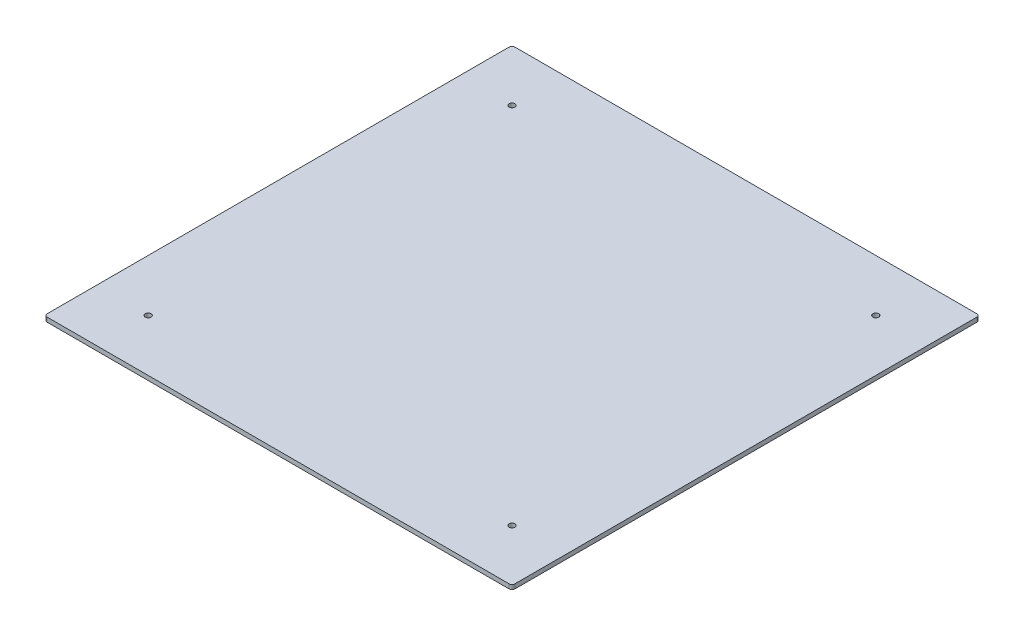
ISO-10303-21;
HEADER;
FILE_DESCRIPTION(('STEP AP214'),'2;1');
FILE_NAME('part.step','',(''),(''),'','','');
FILE_SCHEMA(('AUTOMOTIVE_DESIGN { 1 0 10303 214 1 1 1 1 }'));
ENDSEC;
DATA;
#1=APPLICATION_CONTEXT('core data for automotive mechanical design processes');
#2=APPLICATION_PROTOCOL_DEFINITION('international standard','automotive_design',2000,#1);
#3=PRODUCT_CONTEXT('',#1,'mechanical');
#4=PRODUCT('Part','Part','',(#3));
#5=PRODUCT_RELATED_PRODUCT_CATEGORY('part','',(#4));
#6=PRODUCT_DEFINITION_FORMATION('','',#4);
#7=PRODUCT_DEFINITION_CONTEXT('part definition',#1,'design');
#8=PRODUCT_DEFINITION('design','',#6,#7);
#9=PRODUCT_DEFINITION_SHAPE('','',#8);
#10=(LENGTH_UNIT() NAMED_UNIT(*) SI_UNIT(.MILLI.,.METRE.));
#11=(NAMED_UNIT(*) PLANE_ANGLE_UNIT() SI_UNIT($,.RADIAN.));
#12=(NAMED_UNIT(*) SI_UNIT($,.STERADIAN.) SOLID_ANGLE_UNIT());
#13=UNCERTAINTY_MEASURE_WITH_UNIT(LENGTH_MEASURE(1.E-05),#10,'distance_accuracy_value','');
#14=(GEOMETRIC_REPRESENTATION_CONTEXT(3) GLOBAL_UNCERTAINTY_ASSIGNED_CONTEXT((#13)) GLOBAL_UNIT_ASSIGNED_CONTEXT((#10,
#11,#12)) REPRESENTATION_CONTEXT('',''));
#15=CARTESIAN_POINT('',(0.,0.,0.));
#16=DIRECTION('',(0.,0.,1.));
#17=DIRECTION('',(1.,0.,0.));
#18=AXIS2_PLACEMENT_3D('',#15,#16,#17);
#19=CARTESIAN_POINT('',(-157.5,3.,157.5));
#20=DIRECTION('',(1.,0.,0.));
#21=DIRECTION('',(0.,0.,-1.));
#22=AXIS2_PLACEMENT_3D('',#19,#20,#21);
#23=PLANE('',#22);
#24=DIRECTION('',(0.,0.,1.));
#25=VECTOR('',#24,1.);
#26=CARTESIAN_POINT('',(-157.5,3.,157.5));
#27=LINE('',#26,#25);
#28=CARTESIAN_POINT('',(-157.5,3.,-155.5));
#29=VERTEX_POINT('',#28);
#30=CARTESIAN_POINT('',(-157.5,3.,155.5));
#31=VERTEX_POINT('',#30);
#32=EDGE_CURVE('E119',#29,#31,#27,.T.);
#33=ORIENTED_EDGE('',*,*,#32,.F.);
#34=DIRECTION('',(0.,-1.,0.));
#35=VECTOR('',#34,1.);
#36=CARTESIAN_POINT('',(-157.5,3.,-155.5));
#37=LINE('',#36,#35);
#38=CARTESIAN_POINT('',(-157.5,0.,-155.5));
#39=VERTEX_POINT('',#38);
#40=EDGE_CURVE('E104',#29,#39,#37,.T.);
#41=ORIENTED_EDGE('',*,*,#40,.T.);
#42=DIRECTION('',(0.,0.,1.));
#43=VECTOR('',#42,1.);
#44=CARTESIAN_POINT('',(-157.5,0.,157.5));
#45=LINE('',#44,#43);
#46=CARTESIAN_POINT('',(-157.5,0.,155.5));
#47=VERTEX_POINT('',#46);
#48=EDGE_CURVE('E116',#39,#47,#45,.T.);
#49=ORIENTED_EDGE('',*,*,#48,.T.);
#50=DIRECTION('',(0.,-1.,0.));
#51=VECTOR('',#50,1.);
#52=CARTESIAN_POINT('',(-157.5,3.,155.5));
#53=LINE('',#52,#51);
#54=EDGE_CURVE('E121',#47,#31,#53,.F.);
#55=ORIENTED_EDGE('',*,*,#54,.T.);
#56=EDGE_LOOP('',(#33,#41,#49,#55));
#57=FACE_BOUND('',#56,.T.);
#58=ADVANCED_FACE('F34',(#57),#23,.F.);
#59=CARTESIAN_POINT('',(157.5,3.,157.5));
#60=DIRECTION('',(0.,0.,-1.));
#61=DIRECTION('',(-1.,0.,0.));
#62=AXIS2_PLACEMENT_3D('',#59,#60,#61);
#63=PLANE('',#62);
#64=DIRECTION('',(1.,0.,0.));
#65=VECTOR('',#64,1.);
#66=CARTESIAN_POINT('',(157.5,0.,157.5));
#67=LINE('',#66,#65);
#68=CARTESIAN_POINT('',(-155.5,0.,157.5));
#69=VERTEX_POINT('',#68);
#70=CARTESIAN_POINT('',(155.5,0.,157.5));
#71=VERTEX_POINT('',#70);
#72=EDGE_CURVE('E125',#69,#71,#67,.T.);
#73=ORIENTED_EDGE('',*,*,#72,.T.);
#74=DIRECTION('',(0.,-1.,0.));
#75=VECTOR('',#74,1.);
#76=CARTESIAN_POINT('',(155.5,3.,157.5));
#77=LINE('',#76,#75);
#78=CARTESIAN_POINT('',(155.5,3.,157.5));
#79=VERTEX_POINT('',#78);
#80=EDGE_CURVE('E11',#71,#79,#77,.F.);
#81=ORIENTED_EDGE('',*,*,#80,.T.);
#82=DIRECTION('',(1.,0.,0.));
#83=VECTOR('',#82,1.);
#84=CARTESIAN_POINT('',(157.5,3.,157.5));
#85=LINE('',#84,#83);
#86=CARTESIAN_POINT('',(-155.5,3.,157.5));
#87=VERTEX_POINT('',#86);
#88=EDGE_CURVE('E174',#87,#79,#85,.T.);
#89=ORIENTED_EDGE('',*,*,#88,.F.);
#90=DIRECTION('',(0.,-1.,0.));
#91=VECTOR('',#90,1.);
#92=CARTESIAN_POINT('',(-155.5,3.,157.5));
#93=LINE('',#92,#91);
#94=EDGE_CURVE('E42',#87,#69,#93,.T.);
#95=ORIENTED_EDGE('',*,*,#94,.T.);
#96=EDGE_LOOP('',(#73,#81,#89,#95));
#97=FACE_BOUND('',#96,.T.);
#98=ADVANCED_FACE('F172',(#97),#63,.F.);
#99=CARTESIAN_POINT('',(157.5,3.,157.5));
#100=DIRECTION('',(-1.,0.,0.));
#101=DIRECTION('',(0.,0.,1.));
#102=AXIS2_PLACEMENT_3D('',#99,#100,#101);
#103=PLANE('',#102);
#104=DIRECTION('',(0.,0.,-1.));
#105=VECTOR('',#104,1.);
#106=CARTESIAN_POINT('',(157.5,0.,157.5));
#107=LINE('',#106,#105);
#108=CARTESIAN_POINT('',(157.5,0.,155.5));
#109=VERTEX_POINT('',#108);
#110=CARTESIAN_POINT('',(157.5,0.,-155.5));
#111=VERTEX_POINT('',#110);
#112=EDGE_CURVE('E129',#109,#111,#107,.T.);
#113=ORIENTED_EDGE('',*,*,#112,.T.);
#114=DIRECTION('',(0.,-1.,0.));
#115=VECTOR('',#114,1.);
#116=CARTESIAN_POINT('',(157.5,3.,-155.5));
#117=LINE('',#116,#115);
#118=CARTESIAN_POINT('',(157.5,3.,-155.5));
#119=VERTEX_POINT('',#118);
#120=EDGE_CURVE('E49',#111,#119,#117,.F.);
#121=ORIENTED_EDGE('',*,*,#120,.T.);
#122=DIRECTION('',(0.,0.,-1.));
#123=VECTOR('',#122,1.);
#124=CARTESIAN_POINT('',(157.5,3.,157.5));
#125=LINE('',#124,#123);
#126=CARTESIAN_POINT('',(157.5,3.,155.5));
#127=VERTEX_POINT('',#126);
#128=EDGE_CURVE('E182',#127,#119,#125,.T.);
#129=ORIENTED_EDGE('',*,*,#128,.F.);
#130=DIRECTION('',(0.,-1.,0.));
#131=VECTOR('',#130,1.);
#132=CARTESIAN_POINT('',(157.5,3.,155.5));
#133=LINE('',#132,#131);
#134=EDGE_CURVE('E165',#127,#109,#133,.T.);
#135=ORIENTED_EDGE('',*,*,#134,.T.);
#136=EDGE_LOOP('',(#113,#121,#129,#135));
#137=FACE_BOUND('',#136,.T.);
#138=ADVANCED_FACE('F181',(#137),#103,.F.);
#139=CARTESIAN_POINT('',(157.5,3.,-157.5));
#140=DIRECTION('',(0.,0.,1.));
#141=DIRECTION('',(1.,0.,0.));
#142=AXIS2_PLACEMENT_3D('',#139,#140,#141);
#143=PLANE('',#142);
#144=DIRECTION('',(-1.,0.,0.));
#145=VECTOR('',#144,1.);
#146=CARTESIAN_POINT('',(157.5,0.,-157.5));
#147=LINE('',#146,#145);
#148=CARTESIAN_POINT('',(155.5,0.,-157.5));
#149=VERTEX_POINT('',#148);
#150=CARTESIAN_POINT('',(-155.5,0.,-157.5));
#151=VERTEX_POINT('',#150);
#152=EDGE_CURVE('E139',#149,#151,#147,.T.);
#153=ORIENTED_EDGE('',*,*,#152,.T.);
#154=DIRECTION('',(0.,-1.,0.));
#155=VECTOR('',#154,1.);
#156=CARTESIAN_POINT('',(-155.5,3.,-157.5));
#157=LINE('',#156,#155);
#158=CARTESIAN_POINT('',(-155.5,3.,-157.5));
#159=VERTEX_POINT('',#158);
#160=EDGE_CURVE('E105',#151,#159,#157,.F.);
#161=ORIENTED_EDGE('',*,*,#160,.T.);
#162=DIRECTION('',(-1.,0.,0.));
#163=VECTOR('',#162,1.);
#164=CARTESIAN_POINT('',(157.5,3.,-157.5));
#165=LINE('',#164,#163);
#166=CARTESIAN_POINT('',(155.5,3.,-157.5));
#167=VERTEX_POINT('',#166);
#168=EDGE_CURVE('E135',#167,#159,#165,.T.);
#169=ORIENTED_EDGE('',*,*,#168,.F.);
#170=DIRECTION('',(0.,-1.,0.));
#171=VECTOR('',#170,1.);
#172=CARTESIAN_POINT('',(155.5,3.,-157.5));
#173=LINE('',#172,#171);
#174=EDGE_CURVE('E110',#167,#149,#173,.T.);
#175=ORIENTED_EDGE('',*,*,#174,.T.);
#176=EDGE_LOOP('',(#153,#161,#169,#175));
#177=FACE_BOUND('',#176,.T.);
#178=ADVANCED_FACE('F206',(#177),#143,.F.);
#179=CARTESIAN_POINT('',(0.,3.,0.));
#180=DIRECTION('',(0.,1.,0.));
#181=DIRECTION('',(0.,0.,1.));
#182=AXIS2_PLACEMENT_3D('',#179,#180,#181);
#183=PLANE('',#182);
#184=CARTESIAN_POINT('',(-122.5,3.,122.5));
#185=DIRECTION('',(0.,1.,0.));
#186=DIRECTION('',(0.,0.,1.));
#187=AXIS2_PLACEMENT_3D('',#184,#185,#186);
#188=CIRCLE('',#187,2.);
#189=CARTESIAN_POINT('',(-122.5,3.,124.5));
#190=VERTEX_POINT('',#189);
#191=EDGE_CURVE('E191',#190,#190,#188,.T.);
#192=ORIENTED_EDGE('',*,*,#191,.F.);
#193=EDGE_LOOP('',(#192));
#194=FACE_BOUND('',#193,.T.);
#195=CARTESIAN_POINT('',(122.5,3.,122.5));
#196=DIRECTION('',(0.,1.,0.));
#197=DIRECTION('',(0.,0.,1.));
#198=AXIS2_PLACEMENT_3D('',#195,#196,#197);
#199=CIRCLE('',#198,2.);
#200=CARTESIAN_POINT('',(122.5,3.,124.5));
#201=VERTEX_POINT('',#200);
#202=EDGE_CURVE('E194',#201,#201,#199,.T.);
#203=ORIENTED_EDGE('',*,*,#202,.F.);
#204=EDGE_LOOP('',(#203));
#205=FACE_BOUND('',#204,.T.);
#206=CARTESIAN_POINT('',(122.5,3.,-122.5));
#207=DIRECTION('',(0.,1.,0.));
#208=DIRECTION('',(0.,0.,1.));
#209=AXIS2_PLACEMENT_3D('',#206,#207,#208);
#210=CIRCLE('',#209,2.);
#211=CARTESIAN_POINT('',(122.5,3.,-120.5));
#212=VERTEX_POINT('',#211);
#213=EDGE_CURVE('E190',#212,#212,#210,.T.);
#214=ORIENTED_EDGE('',*,*,#213,.F.);
#215=EDGE_LOOP('',(#214));
#216=FACE_BOUND('',#215,.T.);
#217=CARTESIAN_POINT('',(-122.5,3.,-122.5));
#218=DIRECTION('',(0.,1.,0.));
#219=DIRECTION('',(0.,0.,1.));
#220=AXIS2_PLACEMENT_3D('',#217,#218,#219);
#221=CIRCLE('',#220,2.);
#222=CARTESIAN_POINT('',(-122.5,3.,-120.5));
#223=VERTEX_POINT('',#222);
#224=EDGE_CURVE('E145',#223,#223,#221,.T.);
#225=ORIENTED_EDGE('',*,*,#224,.F.);
#226=EDGE_LOOP('',(#225));
#227=FACE_BOUND('',#226,.T.);
#228=ORIENTED_EDGE('',*,*,#168,.T.);
#229=CARTESIAN_POINT('',(-155.5,3.,-155.5));
#230=DIRECTION('',(0.,1.,0.));
#231=DIRECTION('',(0.,0.,1.));
#232=AXIS2_PLACEMENT_3D('',#229,#230,#231);
#233=CIRCLE('',#232,2.);
#234=EDGE_CURVE('E163',#159,#29,#233,.T.);
#235=ORIENTED_EDGE('',*,*,#234,.T.);
#236=ORIENTED_EDGE('',*,*,#32,.T.);
#237=CARTESIAN_POINT('',(-155.5,3.,155.5));
#238=DIRECTION('',(0.,1.,0.));
#239=DIRECTION('',(0.,0.,1.));
#240=AXIS2_PLACEMENT_3D('',#237,#238,#239);
#241=CIRCLE('',#240,2.);
#242=EDGE_CURVE('E158',#31,#87,#241,.T.);
#243=ORIENTED_EDGE('',*,*,#242,.T.);
#244=ORIENTED_EDGE('',*,*,#88,.T.);
#245=CARTESIAN_POINT('',(155.5,3.,155.5));
#246=DIRECTION('',(0.,1.,0.));
#247=DIRECTION('',(0.,0.,1.));
#248=AXIS2_PLACEMENT_3D('',#245,#246,#247);
#249=CIRCLE('',#248,2.);
#250=EDGE_CURVE('E56',#79,#127,#249,.T.);
#251=ORIENTED_EDGE('',*,*,#250,.T.);
#252=ORIENTED_EDGE('',*,*,#128,.T.);
#253=CARTESIAN_POINT('',(155.5,3.,-155.5));
#254=DIRECTION('',(0.,1.,0.));
#255=DIRECTION('',(0.,0.,1.));
#256=AXIS2_PLACEMENT_3D('',#253,#254,#255);
#257=CIRCLE('',#256,2.);
#258=EDGE_CURVE('E161',#119,#167,#257,.T.);
#259=ORIENTED_EDGE('',*,*,#258,.T.);
#260=EDGE_LOOP('',(#228,#235,#236,#243,#244,#251,#252,#259));
#261=FACE_BOUND('',#260,.T.);
#262=ADVANCED_FACE('F203',(#194,#205,#216,#227,#261),#183,.T.);
#263=CARTESIAN_POINT('',(0.,0.,0.));
#264=DIRECTION('',(0.,1.,0.));
#265=DIRECTION('',(0.,0.,1.));
#266=AXIS2_PLACEMENT_3D('',#263,#264,#265);
#267=PLANE('',#266);
#268=CARTESIAN_POINT('',(-122.5,0.,122.5));
#269=DIRECTION('',(0.,1.,0.));
#270=DIRECTION('',(0.,0.,1.));
#271=AXIS2_PLACEMENT_3D('',#268,#269,#270);
#272=CIRCLE('',#271,2.);
#273=CARTESIAN_POINT('',(-122.5,0.,124.5));
#274=VERTEX_POINT('',#273);
#275=EDGE_CURVE('E126',#274,#274,#272,.T.);
#276=ORIENTED_EDGE('',*,*,#275,.T.);
#277=EDGE_LOOP('',(#276));
#278=FACE_BOUND('',#277,.T.);
#279=CARTESIAN_POINT('',(122.5,0.,122.5));
#280=DIRECTION('',(0.,1.,0.));
#281=DIRECTION('',(0.,0.,1.));
#282=AXIS2_PLACEMENT_3D('',#279,#280,#281);
#283=CIRCLE('',#282,2.);
#284=CARTESIAN_POINT('',(122.5,0.,124.5));
#285=VERTEX_POINT('',#284);
#286=EDGE_CURVE('E132',#285,#285,#283,.T.);
#287=ORIENTED_EDGE('',*,*,#286,.T.);
#288=EDGE_LOOP('',(#287));
#289=FACE_BOUND('',#288,.T.);
#290=CARTESIAN_POINT('',(122.5,0.,-122.5));
#291=DIRECTION('',(0.,1.,0.));
#292=DIRECTION('',(0.,0.,1.));
#293=AXIS2_PLACEMENT_3D('',#290,#291,#292);
#294=CIRCLE('',#293,2.);
#295=CARTESIAN_POINT('',(122.5,0.,-120.5));
#296=VERTEX_POINT('',#295);
#297=EDGE_CURVE('E144',#296,#296,#294,.T.);
#298=ORIENTED_EDGE('',*,*,#297,.T.);
#299=EDGE_LOOP('',(#298));
#300=FACE_BOUND('',#299,.T.);
#301=CARTESIAN_POINT('',(-122.5,0.,-122.5));
#302=DIRECTION('',(0.,1.,0.));
#303=DIRECTION('',(0.,0.,1.));
#304=AXIS2_PLACEMENT_3D('',#301,#302,#303);
#305=CIRCLE('',#304,2.);
#306=CARTESIAN_POINT('',(-122.5,0.,-120.5));
#307=VERTEX_POINT('',#306);
#308=EDGE_CURVE('E141',#307,#307,#305,.T.);
#309=ORIENTED_EDGE('',*,*,#308,.T.);
#310=EDGE_LOOP('',(#309));
#311=FACE_BOUND('',#310,.T.);
#312=ORIENTED_EDGE('',*,*,#48,.F.);
#313=CARTESIAN_POINT('',(-155.5,0.,-155.5));
#314=DIRECTION('',(0.,1.,0.));
#315=DIRECTION('',(0.,0.,1.));
#316=AXIS2_PLACEMENT_3D('',#313,#314,#315);
#317=CIRCLE('',#316,2.);
#318=EDGE_CURVE('E100',#39,#151,#317,.F.);
#319=ORIENTED_EDGE('',*,*,#318,.T.);
#320=ORIENTED_EDGE('',*,*,#152,.F.);
#321=CARTESIAN_POINT('',(155.5,0.,-155.5));
#322=DIRECTION('',(0.,1.,0.));
#323=DIRECTION('',(0.,0.,1.));
#324=AXIS2_PLACEMENT_3D('',#321,#322,#323);
#325=CIRCLE('',#324,2.);
#326=EDGE_CURVE('E111',#149,#111,#325,.F.);
#327=ORIENTED_EDGE('',*,*,#326,.T.);
#328=ORIENTED_EDGE('',*,*,#112,.F.);
#329=CARTESIAN_POINT('',(155.5,0.,155.5));
#330=DIRECTION('',(0.,1.,0.));
#331=DIRECTION('',(0.,0.,1.));
#332=AXIS2_PLACEMENT_3D('',#329,#330,#331);
#333=CIRCLE('',#332,2.);
#334=EDGE_CURVE('E152',#109,#71,#333,.F.);
#335=ORIENTED_EDGE('',*,*,#334,.T.);
#336=ORIENTED_EDGE('',*,*,#72,.F.);
#337=CARTESIAN_POINT('',(-155.5,0.,155.5));
#338=DIRECTION('',(0.,1.,0.));
#339=DIRECTION('',(0.,0.,1.));
#340=AXIS2_PLACEMENT_3D('',#337,#338,#339);
#341=CIRCLE('',#340,2.);
#342=EDGE_CURVE('E120',#69,#47,#341,.F.);
#343=ORIENTED_EDGE('',*,*,#342,.T.);
#344=EDGE_LOOP('',(#312,#319,#320,#327,#328,#335,#336,#343));
#345=FACE_BOUND('',#344,.T.);
#346=ADVANCED_FACE('F123',(#278,#289,#300,#311,#345),#267,.F.);
#347=CARTESIAN_POINT('',(-122.5,-7.,-122.5));
#348=DIRECTION('',(0.,1.,0.));
#349=DIRECTION('',(0.,0.,1.));
#350=AXIS2_PLACEMENT_3D('',#347,#348,#349);
#351=CYLINDRICAL_SURFACE('',#350,2.);
#352=ORIENTED_EDGE('',*,*,#224,.T.);
#353=EDGE_LOOP('',(#352));
#354=FACE_BOUND('',#353,.T.);
#355=ORIENTED_EDGE('',*,*,#308,.F.);
#356=EDGE_LOOP('',(#355));
#357=FACE_BOUND('',#356,.T.);
#358=ADVANCED_FACE('F235',(#354,#357),#351,.F.);
#359=CARTESIAN_POINT('',(122.5,-7.,-122.5));
#360=DIRECTION('',(0.,1.,0.));
#361=DIRECTION('',(0.,0.,1.));
#362=AXIS2_PLACEMENT_3D('',#359,#360,#361);
#363=CYLINDRICAL_SURFACE('',#362,2.);
#364=ORIENTED_EDGE('',*,*,#213,.T.);
#365=EDGE_LOOP('',(#364));
#366=FACE_BOUND('',#365,.T.);
#367=ORIENTED_EDGE('',*,*,#297,.F.);
#368=EDGE_LOOP('',(#367));
#369=FACE_BOUND('',#368,.T.);
#370=ADVANCED_FACE('F200',(#366,#369),#363,.F.);
#371=CARTESIAN_POINT('',(122.5,-7.,122.5));
#372=DIRECTION('',(0.,1.,0.));
#373=DIRECTION('',(0.,0.,1.));
#374=AXIS2_PLACEMENT_3D('',#371,#372,#373);
#375=CYLINDRICAL_SURFACE('',#374,2.);
#376=ORIENTED_EDGE('',*,*,#202,.T.);
#377=EDGE_LOOP('',(#376));
#378=FACE_BOUND('',#377,.T.);
#379=ORIENTED_EDGE('',*,*,#286,.F.);
#380=EDGE_LOOP('',(#379));
#381=FACE_BOUND('',#380,.T.);
#382=ADVANCED_FACE('F243',(#378,#381),#375,.F.);
#383=CARTESIAN_POINT('',(-122.5,-7.,122.5));
#384=DIRECTION('',(0.,1.,0.));
#385=DIRECTION('',(0.,0.,1.));
#386=AXIS2_PLACEMENT_3D('',#383,#384,#385);
#387=CYLINDRICAL_SURFACE('',#386,2.);
#388=ORIENTED_EDGE('',*,*,#191,.T.);
#389=EDGE_LOOP('',(#388));
#390=FACE_BOUND('',#389,.T.);
#391=ORIENTED_EDGE('',*,*,#275,.F.);
#392=EDGE_LOOP('',(#391));
#393=FACE_BOUND('',#392,.T.);
#394=ADVANCED_FACE('F221',(#390,#393),#387,.F.);
#395=CARTESIAN_POINT('',(-155.5,3.,-155.5));
#396=DIRECTION('',(0.,-1.,0.));
#397=DIRECTION('',(0.,0.,-1.));
#398=AXIS2_PLACEMENT_3D('',#395,#396,#397);
#399=CYLINDRICAL_SURFACE('',#398,2.);
#400=ORIENTED_EDGE('',*,*,#234,.F.);
#401=ORIENTED_EDGE('',*,*,#160,.F.);
#402=ORIENTED_EDGE('',*,*,#318,.F.);
#403=ORIENTED_EDGE('',*,*,#40,.F.);
#404=EDGE_LOOP('',(#400,#401,#402,#403));
#405=FACE_BOUND('',#404,.T.);
#406=ADVANCED_FACE('F103',(#405),#399,.T.);
#407=CARTESIAN_POINT('',(155.5,3.,-155.5));
#408=DIRECTION('',(0.,-1.,0.));
#409=DIRECTION('',(0.,0.,-1.));
#410=AXIS2_PLACEMENT_3D('',#407,#408,#409);
#411=CYLINDRICAL_SURFACE('',#410,2.);
#412=ORIENTED_EDGE('',*,*,#258,.F.);
#413=ORIENTED_EDGE('',*,*,#120,.F.);
#414=ORIENTED_EDGE('',*,*,#326,.F.);
#415=ORIENTED_EDGE('',*,*,#174,.F.);
#416=EDGE_LOOP('',(#412,#413,#414,#415));
#417=FACE_BOUND('',#416,.T.);
#418=ADVANCED_FACE('F214',(#417),#411,.T.);
#419=CARTESIAN_POINT('',(155.5,3.,155.5));
#420=DIRECTION('',(0.,-1.,0.));
#421=DIRECTION('',(0.,0.,-1.));
#422=AXIS2_PLACEMENT_3D('',#419,#420,#421);
#423=CYLINDRICAL_SURFACE('',#422,2.);
#424=ORIENTED_EDGE('',*,*,#250,.F.);
#425=ORIENTED_EDGE('',*,*,#80,.F.);
#426=ORIENTED_EDGE('',*,*,#334,.F.);
#427=ORIENTED_EDGE('',*,*,#134,.F.);
#428=EDGE_LOOP('',(#424,#425,#426,#427));
#429=FACE_BOUND('',#428,.T.);
#430=ADVANCED_FACE('F180',(#429),#423,.T.);
#431=CARTESIAN_POINT('',(-155.5,3.,155.5));
#432=DIRECTION('',(0.,-1.,0.));
#433=DIRECTION('',(0.,0.,-1.));
#434=AXIS2_PLACEMENT_3D('',#431,#432,#433);
#435=CYLINDRICAL_SURFACE('',#434,2.);
#436=ORIENTED_EDGE('',*,*,#242,.F.);
#437=ORIENTED_EDGE('',*,*,#54,.F.);
#438=ORIENTED_EDGE('',*,*,#342,.F.);
#439=ORIENTED_EDGE('',*,*,#94,.F.);
#440=EDGE_LOOP('',(#436,#437,#438,#439));
#441=FACE_BOUND('',#440,.T.);
#442=ADVANCED_FACE('F36',(#441),#435,.T.);
#443=CLOSED_SHELL('',(#58,#98,#138,#178,#262,#346,#358,#370,#382,#394,#406,#418,#430,#442));
#444=MANIFOLD_SOLID_BREP('B2',#443);
#445=ADVANCED_BREP_SHAPE_REPRESENTATION('',(#18,#444),#14);
#446=SHAPE_DEFINITION_REPRESENTATION(#9,#445);
ENDSEC;
END-ISO-10303-21;
